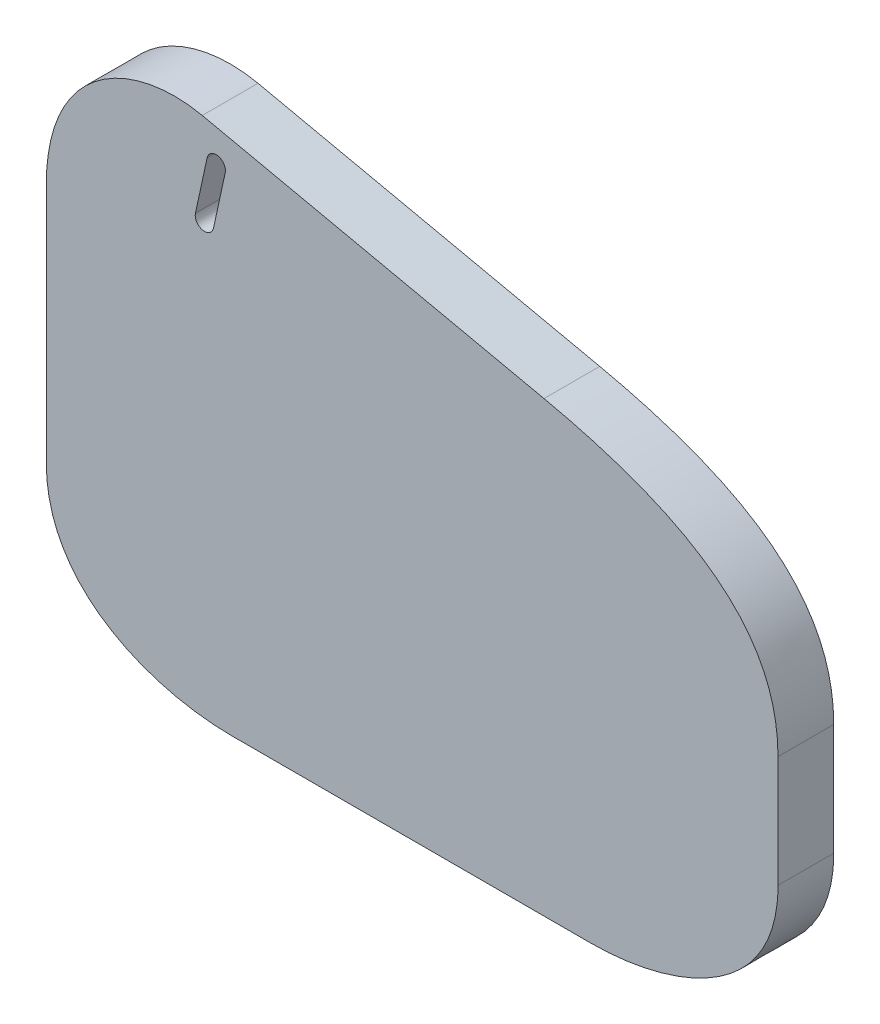
ISO-10303-21;
HEADER;
FILE_DESCRIPTION(('STEP AP214'),'2;1');
FILE_NAME('part.step','',(''),(''),'','','');
FILE_SCHEMA(('AUTOMOTIVE_DESIGN { 1 0 10303 214 1 1 1 1 }'));
ENDSEC;
DATA;
#1=APPLICATION_CONTEXT('core data for automotive mechanical design processes');
#2=APPLICATION_PROTOCOL_DEFINITION('international standard','automotive_design',2000,#1);
#3=PRODUCT_CONTEXT('',#1,'mechanical');
#4=PRODUCT('Part','Part','',(#3));
#5=PRODUCT_RELATED_PRODUCT_CATEGORY('part','',(#4));
#6=PRODUCT_DEFINITION_FORMATION('','',#4);
#7=PRODUCT_DEFINITION_CONTEXT('part definition',#1,'design');
#8=PRODUCT_DEFINITION('design','',#6,#7);
#9=PRODUCT_DEFINITION_SHAPE('','',#8);
#10=(LENGTH_UNIT() NAMED_UNIT(*) SI_UNIT(.MILLI.,.METRE.));
#11=(NAMED_UNIT(*) PLANE_ANGLE_UNIT() SI_UNIT($,.RADIAN.));
#12=(NAMED_UNIT(*) SI_UNIT($,.STERADIAN.) SOLID_ANGLE_UNIT());
#13=UNCERTAINTY_MEASURE_WITH_UNIT(LENGTH_MEASURE(1.E-05),#10,'distance_accuracy_value','');
#14=(GEOMETRIC_REPRESENTATION_CONTEXT(3) GLOBAL_UNCERTAINTY_ASSIGNED_CONTEXT((#13)) GLOBAL_UNIT_ASSIGNED_CONTEXT((#10,
#11,#12)) REPRESENTATION_CONTEXT('',''));
#15=CARTESIAN_POINT('',(0.,0.,0.));
#16=DIRECTION('',(0.,0.,1.));
#17=DIRECTION('',(1.,0.,0.));
#18=AXIS2_PLACEMENT_3D('',#15,#16,#17);
#19=CARTESIAN_POINT('',(-33.5451291028447,-25.7697680525164,10.));
#20=CARTESIAN_POINT('',(-19.4448665678301,-25.7697680525164,10.));
#21=CARTESIAN_POINT('',(0.,-19.0637574545764,10.));
#22=CARTESIAN_POINT('',(0.,0.,10.));
#23=B_SPLINE_CURVE_WITH_KNOTS('',3,(#19,#20,#21,#22),.UNSPECIFIED.,.F.,.F.,(4,4),(0.,1.),.UNSPECIFIED.);
#24=DIRECTION('',(0.,0.,-1.));
#25=VECTOR('',#24,1.);
#26=SURFACE_OF_LINEAR_EXTRUSION('',#23,#25);
#27=CARTESIAN_POINT('',(-33.5451291028447,-25.7697680525164,0.));
#28=CARTESIAN_POINT('',(-19.4448665678301,-25.7697680525164,0.));
#29=CARTESIAN_POINT('',(0.,-19.0637574545764,0.));
#30=CARTESIAN_POINT('',(0.,0.,0.));
#31=B_SPLINE_CURVE_WITH_KNOTS('',3,(#27,#28,#29,#30),.UNSPECIFIED.,.F.,.F.,(4,4),(0.,1.),.UNSPECIFIED.);
#32=CARTESIAN_POINT('',(-33.5451291028447,-25.7697680525164,0.));
#33=VERTEX_POINT('',#32);
#34=CARTESIAN_POINT('',(0.,0.,0.));
#35=VERTEX_POINT('',#34);
#36=EDGE_CURVE('E158',#33,#35,#31,.T.);
#37=ORIENTED_EDGE('',*,*,#36,.T.);
#38=DIRECTION('',(0.,0.,-1.));
#39=VECTOR('',#38,1.);
#40=CARTESIAN_POINT('',(0.,0.,10.));
#41=LINE('',#40,#39);
#42=CARTESIAN_POINT('',(0.,0.,10.));
#43=VERTEX_POINT('',#42);
#44=EDGE_CURVE('E11',#43,#35,#41,.T.);
#45=ORIENTED_EDGE('',*,*,#44,.F.);
#46=CARTESIAN_POINT('',(-33.5451291028447,-25.7697680525164,10.));
#47=VERTEX_POINT('',#46);
#48=EDGE_CURVE('E161',#47,#43,#23,.T.);
#49=ORIENTED_EDGE('',*,*,#48,.F.);
#50=DIRECTION('',(0.,0.,-1.));
#51=VECTOR('',#50,1.);
#52=CARTESIAN_POINT('',(-33.5451291028447,-25.7697680525164,10.));
#53=LINE('',#52,#51);
#54=EDGE_CURVE('E241',#47,#33,#53,.T.);
#55=ORIENTED_EDGE('',*,*,#54,.T.);
#56=EDGE_LOOP('',(#37,#45,#49,#55));
#57=FACE_BOUND('',#56,.T.);
#58=ADVANCED_FACE('F36',(#57),#26,.F.);
#59=CARTESIAN_POINT('',(0.,0.,10.));
#60=DIRECTION('',(-1.,0.,0.));
#61=DIRECTION('',(0.,0.,1.));
#62=AXIS2_PLACEMENT_3D('',#59,#60,#61);
#63=PLANE('',#62);
#64=DIRECTION('',(0.,1.,0.));
#65=VECTOR('',#64,1.);
#66=CARTESIAN_POINT('',(0.,0.,0.));
#67=LINE('',#66,#65);
#68=CARTESIAN_POINT('',(0.,20.,0.));
#69=VERTEX_POINT('',#68);
#70=EDGE_CURVE('E198',#35,#69,#67,.T.);
#71=ORIENTED_EDGE('',*,*,#70,.T.);
#72=DIRECTION('',(0.,0.,-1.));
#73=VECTOR('',#72,1.);
#74=CARTESIAN_POINT('',(0.,20.,10.));
#75=LINE('',#74,#73);
#76=CARTESIAN_POINT('',(0.,20.,10.));
#77=VERTEX_POINT('',#76);
#78=EDGE_CURVE('E44',#77,#69,#75,.T.);
#79=ORIENTED_EDGE('',*,*,#78,.F.);
#80=DIRECTION('',(0.,1.,0.));
#81=VECTOR('',#80,1.);
#82=CARTESIAN_POINT('',(0.,0.,10.));
#83=LINE('',#82,#81);
#84=EDGE_CURVE('E167',#43,#77,#83,.T.);
#85=ORIENTED_EDGE('',*,*,#84,.F.);
#86=ORIENTED_EDGE('',*,*,#44,.T.);
#87=EDGE_LOOP('',(#71,#79,#85,#86));
#88=FACE_BOUND('',#87,.T.);
#89=ADVANCED_FACE('F188',(#88),#63,.F.);
#90=CARTESIAN_POINT('',(0.,20.,10.));
#91=CARTESIAN_POINT('',(0.,38.1460258986672,10.));
#92=CARTESIAN_POINT('',(-14.2094741821754,48.6110988969908,10.));
#93=CARTESIAN_POINT('',(-41.9869496717725,54.6496805251641,10.));
#94=B_SPLINE_CURVE_WITH_KNOTS('',3,(#90,#91,#92,#93),.UNSPECIFIED.,.F.,.F.,(4,4),(0.,1.),.UNSPECIFIED.);
#95=DIRECTION('',(0.,0.,-1.));
#96=VECTOR('',#95,1.);
#97=SURFACE_OF_LINEAR_EXTRUSION('',#94,#96);
#98=CARTESIAN_POINT('',(0.,20.,0.));
#99=CARTESIAN_POINT('',(0.,38.1460258986672,0.));
#100=CARTESIAN_POINT('',(-14.2094741821754,48.6110988969908,0.));
#101=CARTESIAN_POINT('',(-41.9869496717725,54.6496805251641,0.));
#102=B_SPLINE_CURVE_WITH_KNOTS('',3,(#98,#99,#100,#101),.UNSPECIFIED.,.F.,.F.,(4,4),(0.,1.),.UNSPECIFIED.);
#103=CARTESIAN_POINT('',(-41.9869496717725,54.6496805251641,0.));
#104=VERTEX_POINT('',#103);
#105=EDGE_CURVE('E206',#69,#104,#102,.T.);
#106=ORIENTED_EDGE('',*,*,#105,.T.);
#107=DIRECTION('',(0.,0.,-1.));
#108=VECTOR('',#107,1.);
#109=CARTESIAN_POINT('',(-41.9869496717725,54.6496805251641,10.));
#110=LINE('',#109,#108);
#111=CARTESIAN_POINT('',(-41.9869496717725,54.6496805251641,10.));
#112=VERTEX_POINT('',#111);
#113=EDGE_CURVE('E210',#112,#104,#110,.T.);
#114=ORIENTED_EDGE('',*,*,#113,.F.);
#115=EDGE_CURVE('E173',#77,#112,#94,.T.);
#116=ORIENTED_EDGE('',*,*,#115,.F.);
#117=ORIENTED_EDGE('',*,*,#78,.T.);
#118=EDGE_LOOP('',(#106,#114,#116,#117));
#119=FACE_BOUND('',#118,.T.);
#120=ADVANCED_FACE('F184',(#119),#97,.F.);
#121=CARTESIAN_POINT('',(-41.9869496717725,54.6496805251641,10.));
#122=DIRECTION('',(-0.212429644331044,-0.977176363922801,0.));
#123=DIRECTION('',(0.977176363922801,-0.212429644331044,0.));
#124=AXIS2_PLACEMENT_3D('',#121,#122,#123);
#125=PLANE('',#124);
#126=DIRECTION('',(-0.977176363922801,0.212429644331044,0.));
#127=VECTOR('',#126,1.);
#128=CARTESIAN_POINT('',(-41.9869496717725,54.6496805251641,0.));
#129=LINE('',#128,#127);
#130=CARTESIAN_POINT('',(-103.301225382932,67.9788708971554,0.));
#131=VERTEX_POINT('',#130);
#132=EDGE_CURVE('E214',#104,#131,#129,.T.);
#133=ORIENTED_EDGE('',*,*,#132,.T.);
#134=DIRECTION('',(0.,0.,-1.));
#135=VECTOR('',#134,1.);
#136=CARTESIAN_POINT('',(-103.301225382932,67.9788708971554,10.));
#137=LINE('',#136,#135);
#138=CARTESIAN_POINT('',(-103.301225382932,67.9788708971554,10.));
#139=VERTEX_POINT('',#138);
#140=EDGE_CURVE('E254',#139,#131,#137,.T.);
#141=ORIENTED_EDGE('',*,*,#140,.F.);
#142=DIRECTION('',(-0.977176363922801,0.212429644331044,0.));
#143=VECTOR('',#142,1.);
#144=CARTESIAN_POINT('',(-41.9869496717725,54.6496805251641,10.));
#145=LINE('',#144,#143);
#146=EDGE_CURVE('E178',#112,#139,#145,.T.);
#147=ORIENTED_EDGE('',*,*,#146,.F.);
#148=ORIENTED_EDGE('',*,*,#113,.T.);
#149=EDGE_LOOP('',(#133,#141,#147,#148));
#150=FACE_BOUND('',#149,.T.);
#151=ADVANCED_FACE('F187',(#150),#125,.F.);
#152=CARTESIAN_POINT('',(-103.301225382932,67.9788708971554,10.));
#153=CARTESIAN_POINT('',(-115.500001367253,70.6307787198339,10.));
#154=CARTESIAN_POINT('',(-131.292525164114,63.3933061839038,10.));
#155=CARTESIAN_POINT('',(-131.292525164114,43.097715536105,10.));
#156=B_SPLINE_CURVE_WITH_KNOTS('',3,(#152,#153,#154,#155),.UNSPECIFIED.,.F.,.F.,(4,4),(0.,1.),.UNSPECIFIED.);
#157=DIRECTION('',(0.,0.,-1.));
#158=VECTOR('',#157,1.);
#159=SURFACE_OF_LINEAR_EXTRUSION('',#156,#158);
#160=CARTESIAN_POINT('',(-103.301225382932,67.9788708971554,0.));
#161=CARTESIAN_POINT('',(-115.500001367253,70.6307787198339,0.));
#162=CARTESIAN_POINT('',(-131.292525164114,63.3933061839038,0.));
#163=CARTESIAN_POINT('',(-131.292525164114,43.097715536105,0.));
#164=B_SPLINE_CURVE_WITH_KNOTS('',3,(#160,#161,#162,#163),.UNSPECIFIED.,.F.,.F.,(4,4),(0.,1.),.UNSPECIFIED.);
#165=CARTESIAN_POINT('',(-131.292525164114,43.097715536105,0.));
#166=VERTEX_POINT('',#165);
#167=EDGE_CURVE('E216',#131,#166,#164,.T.);
#168=ORIENTED_EDGE('',*,*,#167,.T.);
#169=DIRECTION('',(0.,0.,-1.));
#170=VECTOR('',#169,1.);
#171=CARTESIAN_POINT('',(-131.292525164114,43.097715536105,10.));
#172=LINE('',#171,#170);
#173=CARTESIAN_POINT('',(-131.292525164114,43.097715536105,10.));
#174=VERTEX_POINT('',#173);
#175=EDGE_CURVE('E251',#174,#166,#172,.T.);
#176=ORIENTED_EDGE('',*,*,#175,.F.);
#177=EDGE_CURVE('E261',#139,#174,#156,.T.);
#178=ORIENTED_EDGE('',*,*,#177,.F.);
#179=ORIENTED_EDGE('',*,*,#140,.T.);
#180=EDGE_LOOP('',(#168,#176,#178,#179));
#181=FACE_BOUND('',#180,.T.);
#182=ADVANCED_FACE('F273',(#181),#159,.F.);
#183=CARTESIAN_POINT('',(-131.292525164114,43.097715536105,10.));
#184=DIRECTION('',(1.,0.,0.));
#185=DIRECTION('',(0.,0.,-1.));
#186=AXIS2_PLACEMENT_3D('',#183,#184,#185);
#187=PLANE('',#186);
#188=DIRECTION('',(0.,-1.,0.));
#189=VECTOR('',#188,1.);
#190=CARTESIAN_POINT('',(-131.292525164114,43.097715536105,0.));
#191=LINE('',#190,#189);
#192=CARTESIAN_POINT('',(-131.292525164114,0.,0.));
#193=VERTEX_POINT('',#192);
#194=EDGE_CURVE('E228',#166,#193,#191,.T.);
#195=ORIENTED_EDGE('',*,*,#194,.T.);
#196=DIRECTION('',(0.,0.,-1.));
#197=VECTOR('',#196,1.);
#198=CARTESIAN_POINT('',(-131.292525164114,0.,10.));
#199=LINE('',#198,#197);
#200=CARTESIAN_POINT('',(-131.292525164114,0.,10.));
#201=VERTEX_POINT('',#200);
#202=EDGE_CURVE('E248',#201,#193,#199,.T.);
#203=ORIENTED_EDGE('',*,*,#202,.F.);
#204=DIRECTION('',(0.,-1.,0.));
#205=VECTOR('',#204,1.);
#206=CARTESIAN_POINT('',(-131.292525164114,43.097715536105,10.));
#207=LINE('',#206,#205);
#208=EDGE_CURVE('E262',#174,#201,#207,.T.);
#209=ORIENTED_EDGE('',*,*,#208,.F.);
#210=ORIENTED_EDGE('',*,*,#175,.T.);
#211=EDGE_LOOP('',(#195,#203,#209,#210));
#212=FACE_BOUND('',#211,.T.);
#213=ADVANCED_FACE('F276',(#212),#187,.F.);
#214=CARTESIAN_POINT('',(-131.292525164114,0.,10.));
#215=CARTESIAN_POINT('',(-131.292525164114,-19.0251558180361,10.));
#216=CARTESIAN_POINT('',(-112.011160689261,-25.7697680525164,10.));
#217=CARTESIAN_POINT('',(-97.9695492341357,-25.7697680525164,10.));
#218=B_SPLINE_CURVE_WITH_KNOTS('',3,(#214,#215,#216,#217),.UNSPECIFIED.,.F.,.F.,(4,4),(0.,1.),.UNSPECIFIED.);
#219=DIRECTION('',(0.,0.,-1.));
#220=VECTOR('',#219,1.);
#221=SURFACE_OF_LINEAR_EXTRUSION('',#218,#220);
#222=CARTESIAN_POINT('',(-131.292525164114,0.,0.));
#223=CARTESIAN_POINT('',(-131.292525164114,-19.0251558180361,0.));
#224=CARTESIAN_POINT('',(-112.011160689261,-25.7697680525164,0.));
#225=CARTESIAN_POINT('',(-97.9695492341357,-25.7697680525164,0.));
#226=B_SPLINE_CURVE_WITH_KNOTS('',3,(#222,#223,#224,#225),.UNSPECIFIED.,.F.,.F.,(4,4),(0.,1.),.UNSPECIFIED.);
#227=CARTESIAN_POINT('',(-97.9695492341357,-25.7697680525164,0.));
#228=VERTEX_POINT('',#227);
#229=EDGE_CURVE('E233',#193,#228,#226,.T.);
#230=ORIENTED_EDGE('',*,*,#229,.T.);
#231=DIRECTION('',(0.,0.,-1.));
#232=VECTOR('',#231,1.);
#233=CARTESIAN_POINT('',(-97.9695492341357,-25.7697680525164,10.));
#234=LINE('',#233,#232);
#235=CARTESIAN_POINT('',(-97.9695492341357,-25.7697680525164,10.));
#236=VERTEX_POINT('',#235);
#237=EDGE_CURVE('E244',#236,#228,#234,.T.);
#238=ORIENTED_EDGE('',*,*,#237,.F.);
#239=EDGE_CURVE('E264',#201,#236,#218,.T.);
#240=ORIENTED_EDGE('',*,*,#239,.F.);
#241=ORIENTED_EDGE('',*,*,#202,.T.);
#242=EDGE_LOOP('',(#230,#238,#240,#241));
#243=FACE_BOUND('',#242,.T.);
#244=ADVANCED_FACE('F280',(#243),#221,.F.);
#245=CARTESIAN_POINT('',(-33.5451291028447,-25.7697680525164,10.));
#246=DIRECTION('',(0.,1.,0.));
#247=DIRECTION('',(0.,0.,1.));
#248=AXIS2_PLACEMENT_3D('',#245,#246,#247);
#249=PLANE('',#248);
#250=DIRECTION('',(1.,0.,0.));
#251=VECTOR('',#250,1.);
#252=CARTESIAN_POINT('',(-33.5451291028447,-25.7697680525164,0.));
#253=LINE('',#252,#251);
#254=EDGE_CURVE('E168',#228,#33,#253,.T.);
#255=ORIENTED_EDGE('',*,*,#254,.T.);
#256=ORIENTED_EDGE('',*,*,#54,.F.);
#257=DIRECTION('',(1.,0.,0.));
#258=VECTOR('',#257,1.);
#259=CARTESIAN_POINT('',(-33.5451291028447,-25.7697680525164,10.));
#260=LINE('',#259,#258);
#261=EDGE_CURVE('E245',#236,#47,#260,.T.);
#262=ORIENTED_EDGE('',*,*,#261,.F.);
#263=ORIENTED_EDGE('',*,*,#237,.T.);
#264=EDGE_LOOP('',(#255,#256,#262,#263));
#265=FACE_BOUND('',#264,.T.);
#266=ADVANCED_FACE('F284',(#265),#249,.F.);
#267=CARTESIAN_POINT('',(-11.4849661007919,-20.0337930717244,10.));
#268=DIRECTION('',(0.,0.,-1.));
#269=DIRECTION('',(-1.,0.,0.));
#270=AXIS2_PLACEMENT_3D('',#267,#268,#269);
#271=PLANE('',#270);
#272=DIRECTION('',(-0.212429644331042,-0.977176363922801,0.));
#273=VECTOR('',#272,1.);
#274=CARTESIAN_POINT('',(-102.429251955031,61.8328823716601,10.));
#275=LINE('',#274,#273);
#276=CARTESIAN_POINT('',(-102.429251955031,61.8328823716601,10.));
#277=VERTEX_POINT('',#276);
#278=CARTESIAN_POINT('',(-104.52778969342,52.1796087750684,10.));
#279=VERTEX_POINT('',#278);
#280=EDGE_CURVE('E134',#277,#279,#275,.T.);
#281=ORIENTED_EDGE('',*,*,#280,.F.);
#282=CARTESIAN_POINT('',(-100.808408277594,61.4805250504783,10.));
#283=DIRECTION('',(0.,0.,-1.));
#284=DIRECTION('',(-1.,0.,0.));
#285=AXIS2_PLACEMENT_3D('',#282,#283,#284);
#286=CIRCLE('',#285,1.65870127162068);
#287=CARTESIAN_POINT('',(-99.1875646001578,61.1281677292964,10.));
#288=VERTEX_POINT('',#287);
#289=EDGE_CURVE('E128',#277,#288,#286,.T.);
#290=ORIENTED_EDGE('',*,*,#289,.T.);
#291=DIRECTION('',(-0.212429644331042,-0.977176363922801,0.));
#292=VECTOR('',#291,1.);
#293=CARTESIAN_POINT('',(-99.1875646001578,61.1281677292964,10.));
#294=LINE('',#293,#292);
#295=CARTESIAN_POINT('',(-101.286102338547,51.4748941327048,10.));
#296=VERTEX_POINT('',#295);
#297=EDGE_CURVE('E137',#288,#296,#294,.T.);
#298=ORIENTED_EDGE('',*,*,#297,.T.);
#299=CARTESIAN_POINT('',(-102.906946015984,51.8272514538866,10.));
#300=DIRECTION('',(0.,0.,-1.));
#301=DIRECTION('',(-1.,0.,0.));
#302=AXIS2_PLACEMENT_3D('',#299,#300,#301);
#303=CIRCLE('',#302,1.65870127162068);
#304=EDGE_CURVE('E51',#296,#279,#303,.T.);
#305=ORIENTED_EDGE('',*,*,#304,.T.);
#306=EDGE_LOOP('',(#281,#290,#298,#305));
#307=FACE_BOUND('',#306,.T.);
#308=ORIENTED_EDGE('',*,*,#48,.T.);
#309=ORIENTED_EDGE('',*,*,#84,.T.);
#310=ORIENTED_EDGE('',*,*,#115,.T.);
#311=ORIENTED_EDGE('',*,*,#146,.T.);
#312=ORIENTED_EDGE('',*,*,#177,.T.);
#313=ORIENTED_EDGE('',*,*,#208,.T.);
#314=ORIENTED_EDGE('',*,*,#239,.T.);
#315=ORIENTED_EDGE('',*,*,#261,.T.);
#316=EDGE_LOOP('',(#308,#309,#310,#311,#312,#313,#314,#315));
#317=FACE_BOUND('',#316,.T.);
#318=ADVANCED_FACE('F141',(#307,#317),#271,.F.);
#319=CARTESIAN_POINT('',(-11.4849661007919,-20.0337930717244,0.));
#320=DIRECTION('',(0.,0.,-1.));
#321=DIRECTION('',(-1.,0.,0.));
#322=AXIS2_PLACEMENT_3D('',#319,#320,#321);
#323=PLANE('',#322);
#324=CARTESIAN_POINT('',(-100.808408277594,61.4805250504783,0.));
#325=DIRECTION('',(0.,0.,-1.));
#326=DIRECTION('',(-1.,0.,0.));
#327=AXIS2_PLACEMENT_3D('',#324,#325,#326);
#328=CIRCLE('',#327,1.65870127162068);
#329=CARTESIAN_POINT('',(-102.429251955031,61.8328823716601,0.));
#330=VERTEX_POINT('',#329);
#331=CARTESIAN_POINT('',(-99.1875646001578,61.1281677292964,0.));
#332=VERTEX_POINT('',#331);
#333=EDGE_CURVE('E59',#330,#332,#328,.T.);
#334=ORIENTED_EDGE('',*,*,#333,.F.);
#335=DIRECTION('',(-0.212429644331042,-0.977176363922801,0.));
#336=VECTOR('',#335,1.);
#337=CARTESIAN_POINT('',(-102.429251955031,61.8328823716601,0.));
#338=LINE('',#337,#336);
#339=CARTESIAN_POINT('',(-104.52778969342,52.1796087750684,0.));
#340=VERTEX_POINT('',#339);
#341=EDGE_CURVE('E143',#330,#340,#338,.T.);
#342=ORIENTED_EDGE('',*,*,#341,.T.);
#343=CARTESIAN_POINT('',(-102.906946015984,51.8272514538866,0.));
#344=DIRECTION('',(0.,0.,-1.));
#345=DIRECTION('',(-1.,0.,0.));
#346=AXIS2_PLACEMENT_3D('',#343,#344,#345);
#347=CIRCLE('',#346,1.65870127162068);
#348=CARTESIAN_POINT('',(-101.286102338547,51.4748941327048,0.));
#349=VERTEX_POINT('',#348);
#350=EDGE_CURVE('E146',#349,#340,#347,.T.);
#351=ORIENTED_EDGE('',*,*,#350,.F.);
#352=DIRECTION('',(-0.212429644331042,-0.977176363922801,0.));
#353=VECTOR('',#352,1.);
#354=CARTESIAN_POINT('',(-99.1875646001578,61.1281677292964,0.));
#355=LINE('',#354,#353);
#356=EDGE_CURVE('E152',#332,#349,#355,.T.);
#357=ORIENTED_EDGE('',*,*,#356,.F.);
#358=EDGE_LOOP('',(#334,#342,#351,#357));
#359=FACE_BOUND('',#358,.T.);
#360=ORIENTED_EDGE('',*,*,#36,.F.);
#361=ORIENTED_EDGE('',*,*,#254,.F.);
#362=ORIENTED_EDGE('',*,*,#229,.F.);
#363=ORIENTED_EDGE('',*,*,#194,.F.);
#364=ORIENTED_EDGE('',*,*,#167,.F.);
#365=ORIENTED_EDGE('',*,*,#132,.F.);
#366=ORIENTED_EDGE('',*,*,#105,.F.);
#367=ORIENTED_EDGE('',*,*,#70,.F.);
#368=EDGE_LOOP('',(#360,#361,#362,#363,#364,#365,#366,#367));
#369=FACE_BOUND('',#368,.T.);
#370=ADVANCED_FACE('F212',(#359,#369),#323,.T.);
#371=CARTESIAN_POINT('',(-100.808408277594,61.4805250504783,10.));
#372=DIRECTION('',(0.,0.,-1.));
#373=DIRECTION('',(-1.,0.,0.));
#374=AXIS2_PLACEMENT_3D('',#371,#372,#373);
#375=CYLINDRICAL_SURFACE('',#374,1.65870127162068);
#376=ORIENTED_EDGE('',*,*,#333,.T.);
#377=DIRECTION('',(0.,0.,-1.));
#378=VECTOR('',#377,1.);
#379=CARTESIAN_POINT('',(-99.1875646001578,61.1281677292964,10.));
#380=LINE('',#379,#378);
#381=EDGE_CURVE('E124',#288,#332,#380,.T.);
#382=ORIENTED_EDGE('',*,*,#381,.F.);
#383=ORIENTED_EDGE('',*,*,#289,.F.);
#384=DIRECTION('',(0.,0.,-1.));
#385=VECTOR('',#384,1.);
#386=CARTESIAN_POINT('',(-102.429251955031,61.8328823716601,10.));
#387=LINE('',#386,#385);
#388=EDGE_CURVE('E156',#277,#330,#387,.T.);
#389=ORIENTED_EDGE('',*,*,#388,.T.);
#390=EDGE_LOOP('',(#376,#382,#383,#389));
#391=FACE_BOUND('',#390,.T.);
#392=ADVANCED_FACE('F126',(#391),#375,.F.);
#393=CARTESIAN_POINT('',(-102.429251955031,61.8328823716601,10.));
#394=DIRECTION('',(0.977176363922801,-0.212429644331042,0.));
#395=DIRECTION('',(0.212429644331042,0.977176363922801,0.));
#396=AXIS2_PLACEMENT_3D('',#393,#394,#395);
#397=PLANE('',#396);
#398=ORIENTED_EDGE('',*,*,#341,.F.);
#399=ORIENTED_EDGE('',*,*,#388,.F.);
#400=ORIENTED_EDGE('',*,*,#280,.T.);
#401=DIRECTION('',(0.,0.,-1.));
#402=VECTOR('',#401,1.);
#403=CARTESIAN_POINT('',(-104.52778969342,52.1796087750684,10.));
#404=LINE('',#403,#402);
#405=EDGE_CURVE('E159',#279,#340,#404,.T.);
#406=ORIENTED_EDGE('',*,*,#405,.T.);
#407=EDGE_LOOP('',(#398,#399,#400,#406));
#408=FACE_BOUND('',#407,.T.);
#409=ADVANCED_FACE('F321',(#408),#397,.T.);
#410=CARTESIAN_POINT('',(-102.906946015984,51.8272514538866,10.));
#411=DIRECTION('',(0.,0.,-1.));
#412=DIRECTION('',(-1.,0.,0.));
#413=AXIS2_PLACEMENT_3D('',#410,#411,#412);
#414=CYLINDRICAL_SURFACE('',#413,1.65870127162068);
#415=ORIENTED_EDGE('',*,*,#350,.T.);
#416=ORIENTED_EDGE('',*,*,#405,.F.);
#417=ORIENTED_EDGE('',*,*,#304,.F.);
#418=DIRECTION('',(0.,0.,-1.));
#419=VECTOR('',#418,1.);
#420=CARTESIAN_POINT('',(-101.286102338547,51.4748941327048,10.));
#421=LINE('',#420,#419);
#422=EDGE_CURVE('E133',#296,#349,#421,.T.);
#423=ORIENTED_EDGE('',*,*,#422,.T.);
#424=EDGE_LOOP('',(#415,#416,#417,#423));
#425=FACE_BOUND('',#424,.T.);
#426=ADVANCED_FACE('F324',(#425),#414,.F.);
#427=CARTESIAN_POINT('',(-99.1875646001578,61.1281677292964,10.));
#428=DIRECTION('',(0.977176363922801,-0.212429644331042,0.));
#429=DIRECTION('',(0.212429644331042,0.977176363922801,0.));
#430=AXIS2_PLACEMENT_3D('',#427,#428,#429);
#431=PLANE('',#430);
#432=ORIENTED_EDGE('',*,*,#356,.T.);
#433=ORIENTED_EDGE('',*,*,#422,.F.);
#434=ORIENTED_EDGE('',*,*,#297,.F.);
#435=ORIENTED_EDGE('',*,*,#381,.T.);
#436=EDGE_LOOP('',(#432,#433,#434,#435));
#437=FACE_BOUND('',#436,.T.);
#438=ADVANCED_FACE('F138',(#437),#431,.F.);
#439=CLOSED_SHELL('',(#58,#89,#120,#151,#182,#213,#244,#266,#318,#370,#392,#409,#426,#438));
#440=MANIFOLD_SOLID_BREP('B2',#439);
#441=ADVANCED_BREP_SHAPE_REPRESENTATION('',(#18,#440),#14);
#442=SHAPE_DEFINITION_REPRESENTATION(#9,#441);
ENDSEC;
END-ISO-10303-21;
